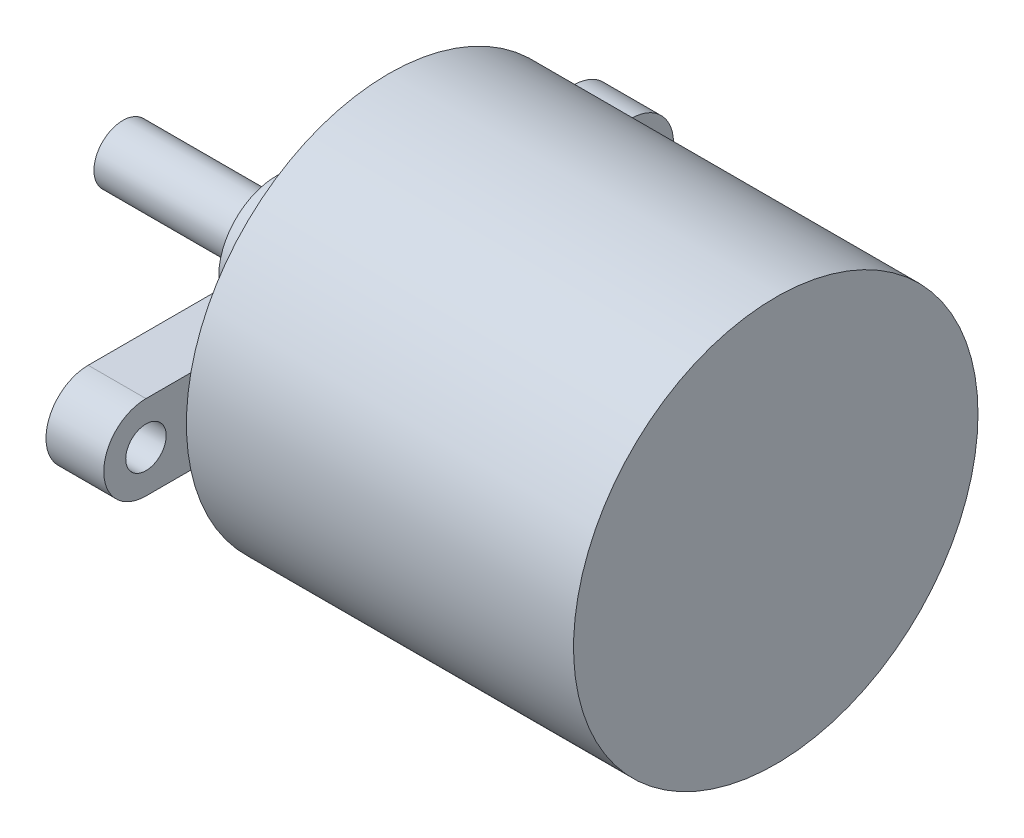
ISO-10303-21;
HEADER;
FILE_DESCRIPTION(('STEP AP214'),'2;1');
FILE_NAME('part.step','',(''),(''),'','','');
FILE_SCHEMA(('AUTOMOTIVE_DESIGN { 1 0 10303 214 1 1 1 1 }'));
ENDSEC;
DATA;
#1=APPLICATION_CONTEXT('core data for automotive mechanical design processes');
#2=APPLICATION_PROTOCOL_DEFINITION('international standard','automotive_design',2000,#1);
#3=PRODUCT_CONTEXT('',#1,'mechanical');
#4=PRODUCT('Part','Part','',(#3));
#5=PRODUCT_RELATED_PRODUCT_CATEGORY('part','',(#4));
#6=PRODUCT_DEFINITION_FORMATION('','',#4);
#7=PRODUCT_DEFINITION_CONTEXT('part definition',#1,'design');
#8=PRODUCT_DEFINITION('design','',#6,#7);
#9=PRODUCT_DEFINITION_SHAPE('','',#8);
#10=(LENGTH_UNIT() NAMED_UNIT(*) SI_UNIT(.MILLI.,.METRE.));
#11=(NAMED_UNIT(*) PLANE_ANGLE_UNIT() SI_UNIT($,.RADIAN.));
#12=(NAMED_UNIT(*) SI_UNIT($,.STERADIAN.) SOLID_ANGLE_UNIT());
#13=UNCERTAINTY_MEASURE_WITH_UNIT(LENGTH_MEASURE(1.E-05),#10,'distance_accuracy_value','');
#14=(GEOMETRIC_REPRESENTATION_CONTEXT(3) GLOBAL_UNCERTAINTY_ASSIGNED_CONTEXT((#13)) GLOBAL_UNIT_ASSIGNED_CONTEXT((#10,
#11,#12)) REPRESENTATION_CONTEXT('',''));
#15=CARTESIAN_POINT('',(0.,0.,0.));
#16=DIRECTION('',(0.,0.,1.));
#17=DIRECTION('',(1.,0.,0.));
#18=AXIS2_PLACEMENT_3D('',#15,#16,#17);
#19=CARTESIAN_POINT('',(-9.7,0.,0.));
#20=DIRECTION('',(-1.,0.,0.));
#21=DIRECTION('',(0.,0.,1.));
#22=AXIS2_PLACEMENT_3D('',#19,#20,#21);
#23=PLANE('',#22);
#24=CARTESIAN_POINT('',(-9.7,0.,0.));
#25=DIRECTION('',(-1.,0.,0.));
#26=DIRECTION('',(0.,0.,1.));
#27=AXIS2_PLACEMENT_3D('',#24,#25,#26);
#28=CIRCLE('',#27,5.);
#29=CARTESIAN_POINT('',(-9.7,0.,5.));
#30=VERTEX_POINT('',#29);
#31=EDGE_CURVE('E124',#30,#30,#28,.T.);
#32=ORIENTED_EDGE('',*,*,#31,.T.);
#33=EDGE_LOOP('',(#32));
#34=FACE_BOUND('',#33,.T.);
#35=CARTESIAN_POINT('',(-9.7,0.,0.));
#36=DIRECTION('',(-1.,0.,0.));
#37=DIRECTION('',(0.,0.,1.));
#38=AXIS2_PLACEMENT_3D('',#35,#36,#37);
#39=CIRCLE('',#38,2.5);
#40=CARTESIAN_POINT('',(-9.7,0.,2.5));
#41=VERTEX_POINT('',#40);
#42=EDGE_CURVE('E380',#41,#41,#39,.T.);
#43=ORIENTED_EDGE('',*,*,#42,.F.);
#44=EDGE_LOOP('',(#43));
#45=FACE_BOUND('',#44,.T.);
#46=ADVANCED_FACE('F33',(#34,#45),#23,.T.);
#47=CARTESIAN_POINT('',(-5.,0.,-21.));
#48=DIRECTION('',(-1.,0.,0.));
#49=DIRECTION('',(0.,0.,1.));
#50=AXIS2_PLACEMENT_3D('',#47,#48,#49);
#51=PLANE('',#50);
#52=CARTESIAN_POINT('',(-5.,0.,0.));
#53=DIRECTION('',(-1.,0.,0.));
#54=DIRECTION('',(0.,0.,1.));
#55=AXIS2_PLACEMENT_3D('',#52,#53,#54);
#56=CIRCLE('',#55,5.);
#57=CARTESIAN_POINT('',(-5.,3.65000000000001,-3.41723572496834));
#58=VERTEX_POINT('',#57);
#59=CARTESIAN_POINT('',(-5.,-3.65,-3.41723572496835));
#60=VERTEX_POINT('',#59);
#61=EDGE_CURVE('E11',#58,#60,#56,.T.);
#62=ORIENTED_EDGE('',*,*,#61,.F.);
#63=DIRECTION('',(0.,0.,-1.));
#64=VECTOR('',#63,1.);
#65=CARTESIAN_POINT('',(-5.,3.65000000000001,-21.));
#66=LINE('',#65,#64);
#67=CARTESIAN_POINT('',(-5.,3.65000000000001,-21.));
#68=VERTEX_POINT('',#67);
#69=EDGE_CURVE('E109',#58,#68,#66,.T.);
#70=ORIENTED_EDGE('',*,*,#69,.T.);
#71=CARTESIAN_POINT('',(-5.,0.,-21.));
#72=DIRECTION('',(-1.,0.,0.));
#73=DIRECTION('',(0.,0.,1.));
#74=AXIS2_PLACEMENT_3D('',#71,#72,#73);
#75=CIRCLE('',#74,3.65000000000001);
#76=CARTESIAN_POINT('',(-5.,-3.65000000000001,-21.));
#77=VERTEX_POINT('',#76);
#78=EDGE_CURVE('E143',#68,#77,#75,.T.);
#79=ORIENTED_EDGE('',*,*,#78,.T.);
#80=DIRECTION('',(0.,0.,1.));
#81=VECTOR('',#80,1.);
#82=CARTESIAN_POINT('',(-5.,-3.65000000000001,-21.));
#83=LINE('',#82,#81);
#84=EDGE_CURVE('E148',#77,#60,#83,.T.);
#85=ORIENTED_EDGE('',*,*,#84,.T.);
#86=EDGE_LOOP('',(#62,#70,#79,#85));
#87=FACE_BOUND('',#86,.T.);
#88=CARTESIAN_POINT('',(-5.,-0.140336266117075,-21.));
#89=DIRECTION('',(-1.,0.,0.));
#90=DIRECTION('',(0.,0.,1.));
#91=AXIS2_PLACEMENT_3D('',#88,#89,#90);
#92=CIRCLE('',#91,1.74999999999999);
#93=CARTESIAN_POINT('',(-5.,-0.140336266117075,-19.25));
#94=VERTEX_POINT('',#93);
#95=EDGE_CURVE('E126',#94,#94,#92,.T.);
#96=ORIENTED_EDGE('',*,*,#95,.F.);
#97=EDGE_LOOP('',(#96));
#98=FACE_BOUND('',#97,.T.);
#99=ADVANCED_FACE('F205',(#87,#98),#51,.T.);
#100=CARTESIAN_POINT('',(0.,0.,0.));
#101=DIRECTION('',(1.,0.,0.));
#102=DIRECTION('',(0.,0.,-1.));
#103=AXIS2_PLACEMENT_3D('',#100,#101,#102);
#104=PLANE('',#103);
#105=DIRECTION('',(0.,0.,-1.));
#106=VECTOR('',#105,1.);
#107=CARTESIAN_POINT('',(0.,3.65000000000001,-21.));
#108=LINE('',#107,#106);
#109=CARTESIAN_POINT('',(0.,3.65000000000001,17.1151248899913));
#110=VERTEX_POINT('',#109);
#111=CARTESIAN_POINT('',(0.,3.65000000000001,-17.1151248899913));
#112=VERTEX_POINT('',#111);
#113=EDGE_CURVE('E122',#110,#112,#108,.T.);
#114=ORIENTED_EDGE('',*,*,#113,.F.);
#115=CARTESIAN_POINT('',(0.,0.,0.));
#116=DIRECTION('',(1.,0.,0.));
#117=DIRECTION('',(0.,0.,-1.));
#118=AXIS2_PLACEMENT_3D('',#115,#116,#117);
#119=CIRCLE('',#118,17.5);
#120=EDGE_CURVE('E37',#112,#110,#119,.T.);
#121=ORIENTED_EDGE('',*,*,#120,.F.);
#122=EDGE_LOOP('',(#114,#121));
#123=FACE_BOUND('',#122,.T.);
#124=ADVANCED_FACE('F202',(#123),#104,.F.);
#125=DIRECTION('',(0.,0.,1.));
#126=VECTOR('',#125,1.);
#127=CARTESIAN_POINT('',(0.,-3.65000000000001,-21.));
#128=LINE('',#127,#126);
#129=CARTESIAN_POINT('',(0.,-3.65000000000001,-17.1151248899913));
#130=VERTEX_POINT('',#129);
#131=CARTESIAN_POINT('',(0.,-3.65,17.1151248899913));
#132=VERTEX_POINT('',#131);
#133=EDGE_CURVE('E159',#130,#132,#128,.T.);
#134=ORIENTED_EDGE('',*,*,#133,.F.);
#135=EDGE_CURVE('E183',#132,#130,#119,.T.);
#136=ORIENTED_EDGE('',*,*,#135,.F.);
#137=EDGE_LOOP('',(#134,#136));
#138=FACE_BOUND('',#137,.T.);
#139=ADVANCED_FACE('F204',(#138),#104,.F.);
#140=CARTESIAN_POINT('',(33.5,0.,0.));
#141=DIRECTION('',(-1.,0.,0.));
#142=DIRECTION('',(0.,0.,1.));
#143=AXIS2_PLACEMENT_3D('',#140,#141,#142);
#144=CYLINDRICAL_SURFACE('',#143,17.5);
#145=CARTESIAN_POINT('',(33.5,0.,0.));
#146=DIRECTION('',(1.,0.,0.));
#147=DIRECTION('',(0.,0.,-1.));
#148=AXIS2_PLACEMENT_3D('',#145,#146,#147);
#149=CIRCLE('',#148,17.5);
#150=CARTESIAN_POINT('',(33.5,0.,-17.5));
#151=VERTEX_POINT('',#150);
#152=EDGE_CURVE('E173',#151,#151,#149,.T.);
#153=ORIENTED_EDGE('',*,*,#152,.F.);
#154=EDGE_LOOP('',(#153));
#155=FACE_BOUND('',#154,.T.);
#156=ORIENTED_EDGE('',*,*,#120,.T.);
#157=EDGE_CURVE('E179',#110,#132,#119,.T.);
#158=ORIENTED_EDGE('',*,*,#157,.T.);
#159=ORIENTED_EDGE('',*,*,#135,.T.);
#160=EDGE_CURVE('E172',#130,#112,#119,.T.);
#161=ORIENTED_EDGE('',*,*,#160,.T.);
#162=EDGE_LOOP('',(#156,#158,#159,#161));
#163=FACE_BOUND('',#162,.T.);
#164=ADVANCED_FACE('F35',(#155,#163),#144,.T.);
#165=CARTESIAN_POINT('',(33.5,0.,0.));
#166=DIRECTION('',(1.,0.,0.));
#167=DIRECTION('',(0.,0.,-1.));
#168=AXIS2_PLACEMENT_3D('',#165,#166,#167);
#169=PLANE('',#168);
#170=ORIENTED_EDGE('',*,*,#152,.T.);
#171=EDGE_LOOP('',(#170));
#172=FACE_BOUND('',#171,.T.);
#173=ADVANCED_FACE('F251',(#172),#169,.T.);
#174=CARTESIAN_POINT('',(0.,0.,-21.));
#175=DIRECTION('',(-1.,0.,0.));
#176=DIRECTION('',(0.,0.,1.));
#177=AXIS2_PLACEMENT_3D('',#174,#175,#176);
#178=PLANE('',#177);
#179=CARTESIAN_POINT('',(0.,0.,21.));
#180=DIRECTION('',(-1.,0.,0.));
#181=DIRECTION('',(0.,0.,1.));
#182=AXIS2_PLACEMENT_3D('',#179,#180,#181);
#183=CIRCLE('',#182,1.74999999999999);
#184=CARTESIAN_POINT('',(0.,0.,22.75));
#185=VERTEX_POINT('',#184);
#186=EDGE_CURVE('E139',#185,#185,#183,.T.);
#187=ORIENTED_EDGE('',*,*,#186,.T.);
#188=EDGE_LOOP('',(#187));
#189=FACE_BOUND('',#188,.T.);
#190=ORIENTED_EDGE('',*,*,#157,.F.);
#191=CARTESIAN_POINT('',(0.,3.65000000000002,21.));
#192=VERTEX_POINT('',#191);
#193=EDGE_CURVE('E147',#192,#110,#108,.T.);
#194=ORIENTED_EDGE('',*,*,#193,.F.);
#195=CARTESIAN_POINT('',(0.,0.,21.));
#196=DIRECTION('',(-1.,0.,0.));
#197=DIRECTION('',(0.,0.,1.));
#198=AXIS2_PLACEMENT_3D('',#195,#196,#197);
#199=CIRCLE('',#198,3.65000000000001);
#200=CARTESIAN_POINT('',(0.,-3.65,21.));
#201=VERTEX_POINT('',#200);
#202=EDGE_CURVE('E158',#201,#192,#199,.T.);
#203=ORIENTED_EDGE('',*,*,#202,.F.);
#204=EDGE_CURVE('E154',#132,#201,#128,.T.);
#205=ORIENTED_EDGE('',*,*,#204,.F.);
#206=EDGE_LOOP('',(#190,#194,#203,#205));
#207=FACE_BOUND('',#206,.T.);
#208=ADVANCED_FACE('F241',(#189,#207),#178,.F.);
#209=CARTESIAN_POINT('',(-5.,0.,-21.));
#210=DIRECTION('',(1.,0.,0.));
#211=DIRECTION('',(0.,0.,-1.));
#212=AXIS2_PLACEMENT_3D('',#209,#210,#211);
#213=CYLINDRICAL_SURFACE('',#212,3.65000000000001);
#214=CARTESIAN_POINT('',(0.,0.,-21.));
#215=DIRECTION('',(-1.,0.,0.));
#216=DIRECTION('',(0.,0.,1.));
#217=AXIS2_PLACEMENT_3D('',#214,#215,#216);
#218=CIRCLE('',#217,3.65000000000001);
#219=CARTESIAN_POINT('',(0.,3.65000000000001,-21.));
#220=VERTEX_POINT('',#219);
#221=CARTESIAN_POINT('',(0.,-3.65000000000001,-21.));
#222=VERTEX_POINT('',#221);
#223=EDGE_CURVE('E142',#220,#222,#218,.T.);
#224=ORIENTED_EDGE('',*,*,#223,.T.);
#225=DIRECTION('',(1.,0.,0.));
#226=VECTOR('',#225,1.);
#227=CARTESIAN_POINT('',(-5.,-3.65000000000001,-21.));
#228=LINE('',#227,#226);
#229=EDGE_CURVE('E170',#77,#222,#228,.T.);
#230=ORIENTED_EDGE('',*,*,#229,.F.);
#231=ORIENTED_EDGE('',*,*,#78,.F.);
#232=DIRECTION('',(1.,0.,0.));
#233=VECTOR('',#232,1.);
#234=CARTESIAN_POINT('',(-5.,3.65000000000001,-21.));
#235=LINE('',#234,#233);
#236=EDGE_CURVE('E106',#68,#220,#235,.T.);
#237=ORIENTED_EDGE('',*,*,#236,.T.);
#238=EDGE_LOOP('',(#224,#230,#231,#237));
#239=FACE_BOUND('',#238,.T.);
#240=ADVANCED_FACE('F199',(#239),#213,.T.);
#241=CARTESIAN_POINT('',(-5.,-3.65000000000001,-21.));
#242=DIRECTION('',(0.,1.,0.));
#243=DIRECTION('',(0.,0.,1.));
#244=AXIS2_PLACEMENT_3D('',#241,#242,#243);
#245=PLANE('',#244);
#246=EDGE_CURVE('E155',#222,#130,#128,.T.);
#247=ORIENTED_EDGE('',*,*,#246,.T.);
#248=ORIENTED_EDGE('',*,*,#133,.T.);
#249=ORIENTED_EDGE('',*,*,#204,.T.);
#250=DIRECTION('',(1.,0.,0.));
#251=VECTOR('',#250,1.);
#252=CARTESIAN_POINT('',(-5.,-3.65,21.));
#253=LINE('',#252,#251);
#254=CARTESIAN_POINT('',(-5.,-3.65,21.));
#255=VERTEX_POINT('',#254);
#256=EDGE_CURVE('E167',#255,#201,#253,.T.);
#257=ORIENTED_EDGE('',*,*,#256,.F.);
#258=CARTESIAN_POINT('',(-5.,-3.65,3.41723572496835));
#259=VERTEX_POINT('',#258);
#260=EDGE_CURVE('E146',#259,#255,#83,.T.);
#261=ORIENTED_EDGE('',*,*,#260,.F.);
#262=EDGE_CURVE('E150',#60,#259,#83,.T.);
#263=ORIENTED_EDGE('',*,*,#262,.F.);
#264=ORIENTED_EDGE('',*,*,#84,.F.);
#265=ORIENTED_EDGE('',*,*,#229,.T.);
#266=EDGE_LOOP('',(#247,#248,#249,#257,#261,#263,#264,#265));
#267=FACE_BOUND('',#266,.T.);
#268=ADVANCED_FACE('F195',(#267),#245,.F.);
#269=CARTESIAN_POINT('',(-5.,0.,21.));
#270=DIRECTION('',(1.,0.,0.));
#271=DIRECTION('',(0.,0.,-1.));
#272=AXIS2_PLACEMENT_3D('',#269,#270,#271);
#273=CYLINDRICAL_SURFACE('',#272,3.65000000000001);
#274=ORIENTED_EDGE('',*,*,#202,.T.);
#275=DIRECTION('',(1.,0.,0.));
#276=VECTOR('',#275,1.);
#277=CARTESIAN_POINT('',(-5.,3.65000000000002,21.));
#278=LINE('',#277,#276);
#279=CARTESIAN_POINT('',(-5.,3.65000000000002,21.));
#280=VERTEX_POINT('',#279);
#281=EDGE_CURVE('E165',#280,#192,#278,.T.);
#282=ORIENTED_EDGE('',*,*,#281,.F.);
#283=CARTESIAN_POINT('',(-5.,0.,21.));
#284=DIRECTION('',(-1.,0.,0.));
#285=DIRECTION('',(0.,0.,1.));
#286=AXIS2_PLACEMENT_3D('',#283,#284,#285);
#287=CIRCLE('',#286,3.65000000000001);
#288=EDGE_CURVE('E102',#255,#280,#287,.T.);
#289=ORIENTED_EDGE('',*,*,#288,.F.);
#290=ORIENTED_EDGE('',*,*,#256,.T.);
#291=EDGE_LOOP('',(#274,#282,#289,#290));
#292=FACE_BOUND('',#291,.T.);
#293=ADVANCED_FACE('F244',(#292),#273,.T.);
#294=CARTESIAN_POINT('',(-5.,3.65000000000001,-21.));
#295=DIRECTION('',(0.,-1.,0.));
#296=DIRECTION('',(0.,0.,-1.));
#297=AXIS2_PLACEMENT_3D('',#294,#295,#296);
#298=PLANE('',#297);
#299=ORIENTED_EDGE('',*,*,#193,.T.);
#300=ORIENTED_EDGE('',*,*,#113,.T.);
#301=EDGE_CURVE('E161',#112,#220,#108,.T.);
#302=ORIENTED_EDGE('',*,*,#301,.T.);
#303=ORIENTED_EDGE('',*,*,#236,.F.);
#304=ORIENTED_EDGE('',*,*,#69,.F.);
#305=CARTESIAN_POINT('',(-5.,3.65000000000001,3.41723572496834));
#306=VERTEX_POINT('',#305);
#307=EDGE_CURVE('E107',#306,#58,#66,.T.);
#308=ORIENTED_EDGE('',*,*,#307,.F.);
#309=EDGE_CURVE('E97',#280,#306,#66,.T.);
#310=ORIENTED_EDGE('',*,*,#309,.F.);
#311=ORIENTED_EDGE('',*,*,#281,.T.);
#312=EDGE_LOOP('',(#299,#300,#302,#303,#304,#308,#310,#311));
#313=FACE_BOUND('',#312,.T.);
#314=ADVANCED_FACE('F112',(#313),#298,.F.);
#315=EDGE_CURVE('E42',#259,#306,#56,.T.);
#316=ORIENTED_EDGE('',*,*,#315,.F.);
#317=ORIENTED_EDGE('',*,*,#260,.T.);
#318=ORIENTED_EDGE('',*,*,#288,.T.);
#319=ORIENTED_EDGE('',*,*,#309,.T.);
#320=EDGE_LOOP('',(#316,#317,#318,#319));
#321=FACE_BOUND('',#320,.T.);
#322=CARTESIAN_POINT('',(-5.,0.,21.));
#323=DIRECTION('',(-1.,0.,0.));
#324=DIRECTION('',(0.,0.,1.));
#325=AXIS2_PLACEMENT_3D('',#322,#323,#324);
#326=CIRCLE('',#325,1.74999999999999);
#327=CARTESIAN_POINT('',(-5.,0.,22.75));
#328=VERTEX_POINT('',#327);
#329=EDGE_CURVE('E136',#328,#328,#326,.T.);
#330=ORIENTED_EDGE('',*,*,#329,.F.);
#331=EDGE_LOOP('',(#330));
#332=FACE_BOUND('',#331,.T.);
#333=ADVANCED_FACE('F99',(#321,#332),#51,.T.);
#334=CARTESIAN_POINT('',(0.,-0.140336266117075,-21.));
#335=DIRECTION('',(-1.,0.,0.));
#336=DIRECTION('',(0.,0.,1.));
#337=AXIS2_PLACEMENT_3D('',#334,#335,#336);
#338=CIRCLE('',#337,1.74999999999999);
#339=CARTESIAN_POINT('',(0.,-0.140336266117075,-19.25));
#340=VERTEX_POINT('',#339);
#341=EDGE_CURVE('E133',#340,#340,#338,.T.);
#342=ORIENTED_EDGE('',*,*,#341,.T.);
#343=EDGE_LOOP('',(#342));
#344=FACE_BOUND('',#343,.T.);
#345=ORIENTED_EDGE('',*,*,#160,.F.);
#346=ORIENTED_EDGE('',*,*,#246,.F.);
#347=ORIENTED_EDGE('',*,*,#223,.F.);
#348=ORIENTED_EDGE('',*,*,#301,.F.);
#349=EDGE_LOOP('',(#345,#346,#347,#348));
#350=FACE_BOUND('',#349,.T.);
#351=ADVANCED_FACE('F191',(#344,#350),#178,.F.);
#352=CARTESIAN_POINT('',(-5.,0.,21.));
#353=DIRECTION('',(-1.,0.,0.));
#354=DIRECTION('',(0.,0.,1.));
#355=AXIS2_PLACEMENT_3D('',#352,#353,#354);
#356=CYLINDRICAL_SURFACE('',#355,1.74999999999999);
#357=ORIENTED_EDGE('',*,*,#329,.T.);
#358=EDGE_LOOP('',(#357));
#359=FACE_BOUND('',#358,.T.);
#360=ORIENTED_EDGE('',*,*,#186,.F.);
#361=EDGE_LOOP('',(#360));
#362=FACE_BOUND('',#361,.T.);
#363=ADVANCED_FACE('F232',(#359,#362),#356,.F.);
#364=CARTESIAN_POINT('',(-5.,-0.140336266117075,-21.));
#365=DIRECTION('',(-1.,0.,0.));
#366=DIRECTION('',(0.,0.,1.));
#367=AXIS2_PLACEMENT_3D('',#364,#365,#366);
#368=CYLINDRICAL_SURFACE('',#367,1.74999999999999);
#369=ORIENTED_EDGE('',*,*,#95,.T.);
#370=EDGE_LOOP('',(#369));
#371=FACE_BOUND('',#370,.T.);
#372=ORIENTED_EDGE('',*,*,#341,.F.);
#373=EDGE_LOOP('',(#372));
#374=FACE_BOUND('',#373,.T.);
#375=ADVANCED_FACE('F225',(#371,#374),#368,.F.);
#376=CARTESIAN_POINT('',(-5.,0.,0.));
#377=DIRECTION('',(-1.,0.,0.));
#378=DIRECTION('',(0.,0.,1.));
#379=AXIS2_PLACEMENT_3D('',#376,#377,#378);
#380=PLANE('',#379);
#381=EDGE_CURVE('E44',#60,#259,#56,.T.);
#382=ORIENTED_EDGE('',*,*,#381,.F.);
#383=ORIENTED_EDGE('',*,*,#262,.T.);
#384=EDGE_LOOP('',(#382,#383));
#385=FACE_BOUND('',#384,.T.);
#386=ADVANCED_FACE('F222',(#385),#380,.F.);
#387=EDGE_CURVE('E120',#306,#58,#56,.T.);
#388=ORIENTED_EDGE('',*,*,#387,.F.);
#389=ORIENTED_EDGE('',*,*,#307,.T.);
#390=EDGE_LOOP('',(#388,#389));
#391=FACE_BOUND('',#390,.T.);
#392=ADVANCED_FACE('F123',(#391),#380,.F.);
#393=CARTESIAN_POINT('',(-9.7,0.,0.));
#394=DIRECTION('',(1.,0.,0.));
#395=DIRECTION('',(0.,0.,-1.));
#396=AXIS2_PLACEMENT_3D('',#393,#394,#395);
#397=CYLINDRICAL_SURFACE('',#396,5.);
#398=ORIENTED_EDGE('',*,*,#31,.F.);
#399=EDGE_LOOP('',(#398));
#400=FACE_BOUND('',#399,.T.);
#401=ORIENTED_EDGE('',*,*,#387,.T.);
#402=ORIENTED_EDGE('',*,*,#61,.T.);
#403=ORIENTED_EDGE('',*,*,#381,.T.);
#404=ORIENTED_EDGE('',*,*,#315,.T.);
#405=EDGE_LOOP('',(#401,#402,#403,#404));
#406=FACE_BOUND('',#405,.T.);
#407=ADVANCED_FACE('F119',(#400,#406),#397,.T.);
#408=CARTESIAN_POINT('',(-23.,0.,0.));
#409=DIRECTION('',(1.,0.,0.));
#410=DIRECTION('',(0.,0.,-1.));
#411=AXIS2_PLACEMENT_3D('',#408,#409,#410);
#412=CYLINDRICAL_SURFACE('',#411,2.5);
#413=CARTESIAN_POINT('',(-23.,0.,0.));
#414=DIRECTION('',(-1.,0.,0.));
#415=DIRECTION('',(0.,0.,1.));
#416=AXIS2_PLACEMENT_3D('',#413,#414,#415);
#417=CIRCLE('',#416,2.5);
#418=CARTESIAN_POINT('',(-23.,0.,2.5));
#419=VERTEX_POINT('',#418);
#420=EDGE_CURVE('E128',#419,#419,#417,.T.);
#421=ORIENTED_EDGE('',*,*,#420,.F.);
#422=EDGE_LOOP('',(#421));
#423=FACE_BOUND('',#422,.T.);
#424=ORIENTED_EDGE('',*,*,#42,.T.);
#425=EDGE_LOOP('',(#424));
#426=FACE_BOUND('',#425,.T.);
#427=ADVANCED_FACE('F220',(#423,#426),#412,.T.);
#428=CARTESIAN_POINT('',(-23.,0.,0.));
#429=DIRECTION('',(-1.,0.,0.));
#430=DIRECTION('',(0.,0.,1.));
#431=AXIS2_PLACEMENT_3D('',#428,#429,#430);
#432=PLANE('',#431);
#433=ORIENTED_EDGE('',*,*,#420,.T.);
#434=EDGE_LOOP('',(#433));
#435=FACE_BOUND('',#434,.T.);
#436=ADVANCED_FACE('F355',(#435),#432,.T.);
#437=CLOSED_SHELL('',(#46,#99,#124,#139,#164,#173,#208,#240,#268,#293,#314,#333,#351,#363,#375,
#386,#392,#407,#427,#436));
#438=MANIFOLD_SOLID_BREP('B2',#437);
#439=ADVANCED_BREP_SHAPE_REPRESENTATION('',(#18,#438),#14);
#440=SHAPE_DEFINITION_REPRESENTATION(#9,#439);
ENDSEC;
END-ISO-10303-21;
